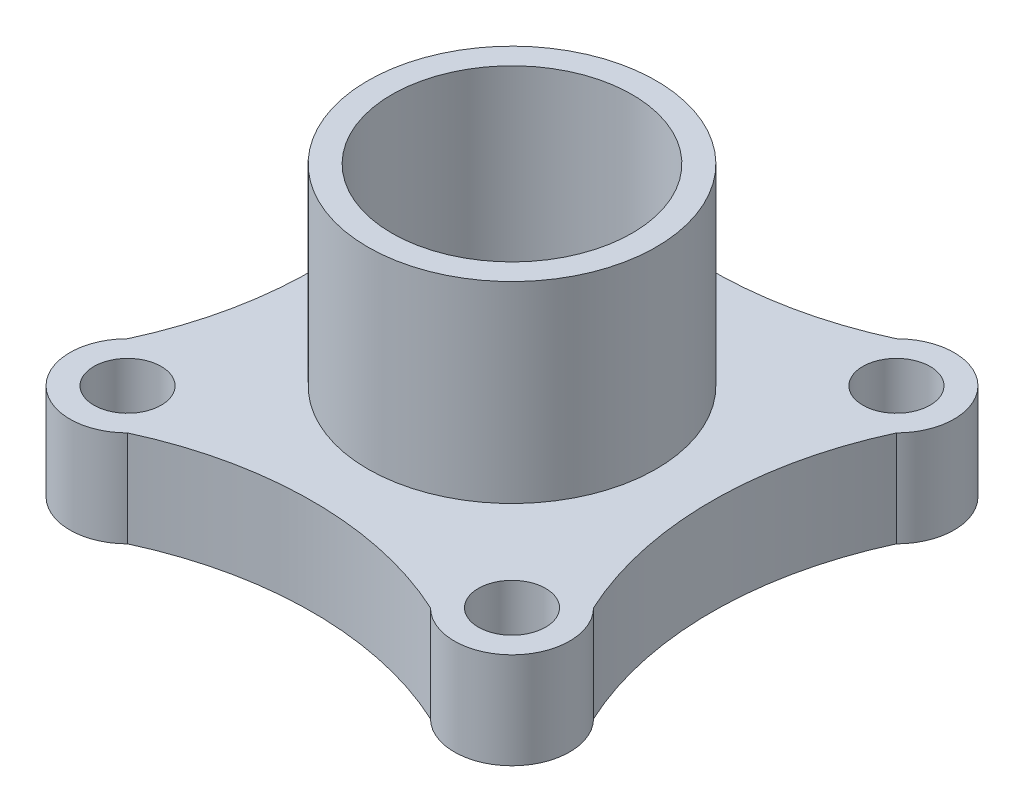
ISO-10303-21;
HEADER;
FILE_DESCRIPTION(('STEP AP214'),'2;1');
FILE_NAME('part.step','',(''),(''),'','','');
FILE_SCHEMA(('AUTOMOTIVE_DESIGN { 1 0 10303 214 1 1 1 1 }'));
ENDSEC;
DATA;
#1=APPLICATION_CONTEXT('core data for automotive mechanical design processes');
#2=APPLICATION_PROTOCOL_DEFINITION('international standard','automotive_design',2000,#1);
#3=PRODUCT_CONTEXT('',#1,'mechanical');
#4=PRODUCT('Part','Part','',(#3));
#5=PRODUCT_RELATED_PRODUCT_CATEGORY('part','',(#4));
#6=PRODUCT_DEFINITION_FORMATION('','',#4);
#7=PRODUCT_DEFINITION_CONTEXT('part definition',#1,'design');
#8=PRODUCT_DEFINITION('design','',#6,#7);
#9=PRODUCT_DEFINITION_SHAPE('','',#8);
#10=(LENGTH_UNIT() NAMED_UNIT(*) SI_UNIT(.MILLI.,.METRE.));
#11=(NAMED_UNIT(*) PLANE_ANGLE_UNIT() SI_UNIT($,.RADIAN.));
#12=(NAMED_UNIT(*) SI_UNIT($,.STERADIAN.) SOLID_ANGLE_UNIT());
#13=UNCERTAINTY_MEASURE_WITH_UNIT(LENGTH_MEASURE(1.E-05),#10,'distance_accuracy_value','');
#14=(GEOMETRIC_REPRESENTATION_CONTEXT(3) GLOBAL_UNCERTAINTY_ASSIGNED_CONTEXT((#13)) GLOBAL_UNIT_ASSIGNED_CONTEXT((#10,
#11,#12)) REPRESENTATION_CONTEXT('',''));
#15=CARTESIAN_POINT('',(0.,0.,0.));
#16=DIRECTION('',(0.,0.,1.));
#17=DIRECTION('',(1.,0.,0.));
#18=AXIS2_PLACEMENT_3D('',#15,#16,#17);
#19=CARTESIAN_POINT('',(0.,40.,0.));
#20=DIRECTION('',(0.,-1.,0.));
#21=DIRECTION('',(0.,0.,-1.));
#22=AXIS2_PLACEMENT_3D('',#19,#20,#21);
#23=CYLINDRICAL_SURFACE('',#22,30.);
#24=CARTESIAN_POINT('',(0.,40.,0.));
#25=DIRECTION('',(0.,1.,0.));
#26=DIRECTION('',(0.,0.,1.));
#27=AXIS2_PLACEMENT_3D('',#24,#25,#26);
#28=CIRCLE('',#27,30.);
#29=CARTESIAN_POINT('',(0.,40.,30.));
#30=VERTEX_POINT('',#29);
#31=EDGE_CURVE('E11',#30,#30,#28,.T.);
#32=ORIENTED_EDGE('',*,*,#31,.F.);
#33=EDGE_LOOP('',(#32));
#34=FACE_BOUND('',#33,.T.);
#35=CARTESIAN_POINT('',(0.,0.,0.));
#36=DIRECTION('',(0.,1.,0.));
#37=DIRECTION('',(0.,0.,1.));
#38=AXIS2_PLACEMENT_3D('',#35,#36,#37);
#39=CIRCLE('',#38,30.);
#40=CARTESIAN_POINT('',(0.,0.,30.));
#41=VERTEX_POINT('',#40);
#42=EDGE_CURVE('E46',#41,#41,#39,.T.);
#43=ORIENTED_EDGE('',*,*,#42,.T.);
#44=EDGE_LOOP('',(#43));
#45=FACE_BOUND('',#44,.T.);
#46=ADVANCED_FACE('F43',(#34,#45),#23,.T.);
#47=CARTESIAN_POINT('',(0.,40.,0.));
#48=DIRECTION('',(0.,1.,0.));
#49=DIRECTION('',(0.,0.,1.));
#50=AXIS2_PLACEMENT_3D('',#47,#48,#49);
#51=PLANE('',#50);
#52=CARTESIAN_POINT('',(0.,40.,0.));
#53=DIRECTION('',(0.,1.,0.));
#54=DIRECTION('',(0.,0.,1.));
#55=AXIS2_PLACEMENT_3D('',#52,#53,#54);
#56=CIRCLE('',#55,25.);
#57=CARTESIAN_POINT('',(0.,40.,25.));
#58=VERTEX_POINT('',#57);
#59=EDGE_CURVE('E401',#58,#58,#56,.T.);
#60=ORIENTED_EDGE('',*,*,#59,.F.);
#61=EDGE_LOOP('',(#60));
#62=FACE_BOUND('',#61,.T.);
#63=ORIENTED_EDGE('',*,*,#31,.T.);
#64=EDGE_LOOP('',(#63));
#65=FACE_BOUND('',#64,.T.);
#66=ADVANCED_FACE('F217',(#62,#65),#51,.T.);
#67=CARTESIAN_POINT('',(0.,-20.,116.542775523958));
#68=DIRECTION('',(0.,1.,0.));
#69=DIRECTION('',(0.,0.,1.));
#70=AXIS2_PLACEMENT_3D('',#67,#68,#69);
#71=CYLINDRICAL_SURFACE('',#70,75.);
#72=CARTESIAN_POINT('',(0.,0.,116.542775523958));
#73=DIRECTION('',(0.,1.,0.));
#74=DIRECTION('',(0.,0.,1.));
#75=AXIS2_PLACEMENT_3D('',#72,#73,#74);
#76=CIRCLE('',#75,75.);
#77=CARTESIAN_POINT('',(31.5147186257614,0.,48.4852813742385));
#78=VERTEX_POINT('',#77);
#79=CARTESIAN_POINT('',(-31.5147186257614,0.,48.4852813742386));
#80=VERTEX_POINT('',#79);
#81=EDGE_CURVE('E145',#78,#80,#76,.T.);
#82=ORIENTED_EDGE('',*,*,#81,.T.);
#83=DIRECTION('',(0.,1.,0.));
#84=VECTOR('',#83,1.);
#85=CARTESIAN_POINT('',(-31.5147186257614,-20.,48.4852813742386));
#86=LINE('',#85,#84);
#87=CARTESIAN_POINT('',(-31.5147186257614,-20.,48.4852813742386));
#88=VERTEX_POINT('',#87);
#89=EDGE_CURVE('E187',#88,#80,#86,.T.);
#90=ORIENTED_EDGE('',*,*,#89,.F.);
#91=CARTESIAN_POINT('',(0.,-20.,116.542775523958));
#92=DIRECTION('',(0.,1.,0.));
#93=DIRECTION('',(0.,0.,1.));
#94=AXIS2_PLACEMENT_3D('',#91,#92,#93);
#95=CIRCLE('',#94,75.);
#96=CARTESIAN_POINT('',(31.5147186257614,-20.,48.4852813742385));
#97=VERTEX_POINT('',#96);
#98=EDGE_CURVE('E168',#97,#88,#95,.T.);
#99=ORIENTED_EDGE('',*,*,#98,.F.);
#100=DIRECTION('',(0.,1.,0.));
#101=VECTOR('',#100,1.);
#102=CARTESIAN_POINT('',(31.5147186257614,-20.,48.4852813742385));
#103=LINE('',#102,#101);
#104=EDGE_CURVE('E141',#97,#78,#103,.T.);
#105=ORIENTED_EDGE('',*,*,#104,.T.);
#106=EDGE_LOOP('',(#82,#90,#99,#105));
#107=FACE_BOUND('',#106,.T.);
#108=ADVANCED_FACE('F204',(#107),#71,.F.);
#109=CARTESIAN_POINT('',(-40.,-20.,40.));
#110=DIRECTION('',(0.,1.,0.));
#111=DIRECTION('',(0.,0.,1.));
#112=AXIS2_PLACEMENT_3D('',#109,#110,#111);
#113=CYLINDRICAL_SURFACE('',#112,12.);
#114=CARTESIAN_POINT('',(-40.,0.,40.));
#115=DIRECTION('',(0.,-1.,0.));
#116=DIRECTION('',(0.,0.,-1.));
#117=AXIS2_PLACEMENT_3D('',#114,#115,#116);
#118=CIRCLE('',#117,12.);
#119=CARTESIAN_POINT('',(-48.4852813742386,0.,31.5147186257614));
#120=VERTEX_POINT('',#119);
#121=EDGE_CURVE('E149',#80,#120,#118,.T.);
#122=ORIENTED_EDGE('',*,*,#121,.T.);
#123=DIRECTION('',(0.,1.,0.));
#124=VECTOR('',#123,1.);
#125=CARTESIAN_POINT('',(-48.4852813742386,-20.,31.5147186257614));
#126=LINE('',#125,#124);
#127=CARTESIAN_POINT('',(-48.4852813742386,-20.,31.5147186257614));
#128=VERTEX_POINT('',#127);
#129=EDGE_CURVE('E183',#128,#120,#126,.T.);
#130=ORIENTED_EDGE('',*,*,#129,.F.);
#131=CARTESIAN_POINT('',(-40.,-20.,40.));
#132=DIRECTION('',(0.,-1.,0.));
#133=DIRECTION('',(0.,0.,-1.));
#134=AXIS2_PLACEMENT_3D('',#131,#132,#133);
#135=CIRCLE('',#134,12.);
#136=EDGE_CURVE('E104',#88,#128,#135,.T.);
#137=ORIENTED_EDGE('',*,*,#136,.F.);
#138=ORIENTED_EDGE('',*,*,#89,.T.);
#139=EDGE_LOOP('',(#122,#130,#137,#138));
#140=FACE_BOUND('',#139,.T.);
#141=ADVANCED_FACE('F228',(#140),#113,.T.);
#142=CARTESIAN_POINT('',(-116.542775523958,-20.,0.));
#143=DIRECTION('',(0.,1.,0.));
#144=DIRECTION('',(0.,0.,1.));
#145=AXIS2_PLACEMENT_3D('',#142,#143,#144);
#146=CYLINDRICAL_SURFACE('',#145,75.);
#147=CARTESIAN_POINT('',(-116.542775523958,0.,0.));
#148=DIRECTION('',(0.,1.,0.));
#149=DIRECTION('',(0.,0.,1.));
#150=AXIS2_PLACEMENT_3D('',#147,#148,#149);
#151=CIRCLE('',#150,75.);
#152=CARTESIAN_POINT('',(-48.4852813742386,0.,-31.5147186257614));
#153=VERTEX_POINT('',#152);
#154=EDGE_CURVE('E153',#120,#153,#151,.T.);
#155=ORIENTED_EDGE('',*,*,#154,.T.);
#156=DIRECTION('',(0.,1.,0.));
#157=VECTOR('',#156,1.);
#158=CARTESIAN_POINT('',(-48.4852813742386,-20.,-31.5147186257614));
#159=LINE('',#158,#157);
#160=CARTESIAN_POINT('',(-48.4852813742386,-20.,-31.5147186257614));
#161=VERTEX_POINT('',#160);
#162=EDGE_CURVE('E179',#161,#153,#159,.T.);
#163=ORIENTED_EDGE('',*,*,#162,.F.);
#164=CARTESIAN_POINT('',(-116.542775523958,-20.,0.));
#165=DIRECTION('',(0.,1.,0.));
#166=DIRECTION('',(0.,0.,1.));
#167=AXIS2_PLACEMENT_3D('',#164,#165,#166);
#168=CIRCLE('',#167,75.);
#169=EDGE_CURVE('E442',#128,#161,#168,.T.);
#170=ORIENTED_EDGE('',*,*,#169,.F.);
#171=ORIENTED_EDGE('',*,*,#129,.T.);
#172=EDGE_LOOP('',(#155,#163,#170,#171));
#173=FACE_BOUND('',#172,.T.);
#174=ADVANCED_FACE('F234',(#173),#146,.F.);
#175=CARTESIAN_POINT('',(-40.,-20.,-40.));
#176=DIRECTION('',(0.,1.,0.));
#177=DIRECTION('',(0.,0.,1.));
#178=AXIS2_PLACEMENT_3D('',#175,#176,#177);
#179=CYLINDRICAL_SURFACE('',#178,12.);
#180=CARTESIAN_POINT('',(-40.,0.,-40.));
#181=DIRECTION('',(0.,-1.,0.));
#182=DIRECTION('',(0.,0.,-1.));
#183=AXIS2_PLACEMENT_3D('',#180,#181,#182);
#184=CIRCLE('',#183,12.);
#185=CARTESIAN_POINT('',(-31.5147186257614,0.,-48.4852813742385));
#186=VERTEX_POINT('',#185);
#187=EDGE_CURVE('E156',#153,#186,#184,.T.);
#188=ORIENTED_EDGE('',*,*,#187,.T.);
#189=DIRECTION('',(0.,1.,0.));
#190=VECTOR('',#189,1.);
#191=CARTESIAN_POINT('',(-31.5147186257614,-20.,-48.4852813742385));
#192=LINE('',#191,#190);
#193=CARTESIAN_POINT('',(-31.5147186257614,-20.,-48.4852813742385));
#194=VERTEX_POINT('',#193);
#195=EDGE_CURVE('E175',#194,#186,#192,.T.);
#196=ORIENTED_EDGE('',*,*,#195,.F.);
#197=CARTESIAN_POINT('',(-40.,-20.,-40.));
#198=DIRECTION('',(0.,-1.,0.));
#199=DIRECTION('',(0.,0.,-1.));
#200=AXIS2_PLACEMENT_3D('',#197,#198,#199);
#201=CIRCLE('',#200,12.);
#202=EDGE_CURVE('E445',#161,#194,#201,.T.);
#203=ORIENTED_EDGE('',*,*,#202,.F.);
#204=ORIENTED_EDGE('',*,*,#162,.T.);
#205=EDGE_LOOP('',(#188,#196,#203,#204));
#206=FACE_BOUND('',#205,.T.);
#207=ADVANCED_FACE('F237',(#206),#179,.T.);
#208=CARTESIAN_POINT('',(0.,-20.,-116.542775523958));
#209=DIRECTION('',(0.,1.,0.));
#210=DIRECTION('',(0.,0.,1.));
#211=AXIS2_PLACEMENT_3D('',#208,#209,#210);
#212=CYLINDRICAL_SURFACE('',#211,75.);
#213=CARTESIAN_POINT('',(0.,0.,-116.542775523958));
#214=DIRECTION('',(0.,1.,0.));
#215=DIRECTION('',(0.,0.,-1.));
#216=AXIS2_PLACEMENT_3D('',#213,#214,#215);
#217=CIRCLE('',#216,75.);
#218=CARTESIAN_POINT('',(31.5147186257614,0.,-48.4852813742386));
#219=VERTEX_POINT('',#218);
#220=EDGE_CURVE('E159',#186,#219,#217,.T.);
#221=ORIENTED_EDGE('',*,*,#220,.T.);
#222=DIRECTION('',(0.,1.,0.));
#223=VECTOR('',#222,1.);
#224=CARTESIAN_POINT('',(31.5147186257614,-20.,-48.4852813742386));
#225=LINE('',#224,#223);
#226=CARTESIAN_POINT('',(31.5147186257614,-20.,-48.4852813742386));
#227=VERTEX_POINT('',#226);
#228=EDGE_CURVE('E134',#227,#219,#225,.T.);
#229=ORIENTED_EDGE('',*,*,#228,.F.);
#230=CARTESIAN_POINT('',(0.,-20.,-116.542775523958));
#231=DIRECTION('',(0.,1.,0.));
#232=DIRECTION('',(0.,0.,-1.));
#233=AXIS2_PLACEMENT_3D('',#230,#231,#232);
#234=CIRCLE('',#233,75.);
#235=EDGE_CURVE('E123',#194,#227,#234,.T.);
#236=ORIENTED_EDGE('',*,*,#235,.F.);
#237=ORIENTED_EDGE('',*,*,#195,.T.);
#238=EDGE_LOOP('',(#221,#229,#236,#237));
#239=FACE_BOUND('',#238,.T.);
#240=ADVANCED_FACE('F241',(#239),#212,.F.);
#241=CARTESIAN_POINT('',(40.,-20.,-40.));
#242=DIRECTION('',(0.,1.,0.));
#243=DIRECTION('',(0.,0.,1.));
#244=AXIS2_PLACEMENT_3D('',#241,#242,#243);
#245=CYLINDRICAL_SURFACE('',#244,12.);
#246=CARTESIAN_POINT('',(40.,0.,-40.));
#247=DIRECTION('',(0.,-1.,0.));
#248=DIRECTION('',(0.,0.,-1.));
#249=AXIS2_PLACEMENT_3D('',#246,#247,#248);
#250=CIRCLE('',#249,12.);
#251=CARTESIAN_POINT('',(48.4852813742386,0.,-31.5147186257614));
#252=VERTEX_POINT('',#251);
#253=EDGE_CURVE('E132',#219,#252,#250,.T.);
#254=ORIENTED_EDGE('',*,*,#253,.T.);
#255=DIRECTION('',(0.,1.,0.));
#256=VECTOR('',#255,1.);
#257=CARTESIAN_POINT('',(48.4852813742386,-20.,-31.5147186257614));
#258=LINE('',#257,#256);
#259=CARTESIAN_POINT('',(48.4852813742386,-20.,-31.5147186257614));
#260=VERTEX_POINT('',#259);
#261=EDGE_CURVE('E129',#260,#252,#258,.T.);
#262=ORIENTED_EDGE('',*,*,#261,.F.);
#263=CARTESIAN_POINT('',(40.,-20.,-40.));
#264=DIRECTION('',(0.,-1.,0.));
#265=DIRECTION('',(0.,0.,-1.));
#266=AXIS2_PLACEMENT_3D('',#263,#264,#265);
#267=CIRCLE('',#266,12.);
#268=EDGE_CURVE('E117',#227,#260,#267,.T.);
#269=ORIENTED_EDGE('',*,*,#268,.F.);
#270=ORIENTED_EDGE('',*,*,#228,.T.);
#271=EDGE_LOOP('',(#254,#262,#269,#270));
#272=FACE_BOUND('',#271,.T.);
#273=ADVANCED_FACE('F130',(#272),#245,.T.);
#274=CARTESIAN_POINT('',(116.542775523958,-20.,0.));
#275=DIRECTION('',(0.,1.,0.));
#276=DIRECTION('',(0.,0.,1.));
#277=AXIS2_PLACEMENT_3D('',#274,#275,#276);
#278=CYLINDRICAL_SURFACE('',#277,75.);
#279=CARTESIAN_POINT('',(116.542775523958,0.,0.));
#280=DIRECTION('',(0.,1.,0.));
#281=DIRECTION('',(0.,0.,1.));
#282=AXIS2_PLACEMENT_3D('',#279,#280,#281);
#283=CIRCLE('',#282,75.);
#284=CARTESIAN_POINT('',(48.4852813742386,0.,31.5147186257614));
#285=VERTEX_POINT('',#284);
#286=EDGE_CURVE('E89',#252,#285,#283,.T.);
#287=ORIENTED_EDGE('',*,*,#286,.T.);
#288=DIRECTION('',(0.,1.,0.));
#289=VECTOR('',#288,1.);
#290=CARTESIAN_POINT('',(48.4852813742386,-20.,31.5147186257614));
#291=LINE('',#290,#289);
#292=CARTESIAN_POINT('',(48.4852813742386,-20.,31.5147186257614));
#293=VERTEX_POINT('',#292);
#294=EDGE_CURVE('E135',#293,#285,#291,.T.);
#295=ORIENTED_EDGE('',*,*,#294,.F.);
#296=CARTESIAN_POINT('',(116.542775523958,-20.,0.));
#297=DIRECTION('',(0.,1.,0.));
#298=DIRECTION('',(0.,0.,1.));
#299=AXIS2_PLACEMENT_3D('',#296,#297,#298);
#300=CIRCLE('',#299,75.);
#301=EDGE_CURVE('E121',#260,#293,#300,.T.);
#302=ORIENTED_EDGE('',*,*,#301,.F.);
#303=ORIENTED_EDGE('',*,*,#261,.T.);
#304=EDGE_LOOP('',(#287,#295,#302,#303));
#305=FACE_BOUND('',#304,.T.);
#306=ADVANCED_FACE('F137',(#305),#278,.F.);
#307=CARTESIAN_POINT('',(40.,-20.,40.));
#308=DIRECTION('',(0.,1.,0.));
#309=DIRECTION('',(0.,0.,1.));
#310=AXIS2_PLACEMENT_3D('',#307,#308,#309);
#311=CYLINDRICAL_SURFACE('',#310,12.);
#312=CARTESIAN_POINT('',(40.,0.,40.));
#313=DIRECTION('',(0.,-1.,0.));
#314=DIRECTION('',(0.,0.,-1.));
#315=AXIS2_PLACEMENT_3D('',#312,#313,#314);
#316=CIRCLE('',#315,12.);
#317=EDGE_CURVE('E95',#285,#78,#316,.T.);
#318=ORIENTED_EDGE('',*,*,#317,.T.);
#319=ORIENTED_EDGE('',*,*,#104,.F.);
#320=CARTESIAN_POINT('',(40.,-20.,40.));
#321=DIRECTION('',(0.,-1.,0.));
#322=DIRECTION('',(0.,0.,-1.));
#323=AXIS2_PLACEMENT_3D('',#320,#321,#322);
#324=CIRCLE('',#323,12.);
#325=EDGE_CURVE('E60',#293,#97,#324,.T.);
#326=ORIENTED_EDGE('',*,*,#325,.F.);
#327=ORIENTED_EDGE('',*,*,#294,.T.);
#328=EDGE_LOOP('',(#318,#319,#326,#327));
#329=FACE_BOUND('',#328,.T.);
#330=ADVANCED_FACE('F206',(#329),#311,.T.);
#331=CARTESIAN_POINT('',(-20.,-20.,78.271387761979));
#332=DIRECTION('',(0.,1.,0.));
#333=DIRECTION('',(0.,0.,1.));
#334=AXIS2_PLACEMENT_3D('',#331,#332,#333);
#335=PLANE('',#334);
#336=CARTESIAN_POINT('',(0.,-20.,0.));
#337=DIRECTION('',(0.,1.,0.));
#338=DIRECTION('',(0.,0.,1.));
#339=AXIS2_PLACEMENT_3D('',#336,#337,#338);
#340=CIRCLE('',#339,25.);
#341=CARTESIAN_POINT('',(0.,-20.,25.));
#342=VERTEX_POINT('',#341);
#343=EDGE_CURVE('E399',#342,#342,#340,.T.);
#344=ORIENTED_EDGE('',*,*,#343,.T.);
#345=EDGE_LOOP('',(#344));
#346=FACE_BOUND('',#345,.T.);
#347=CARTESIAN_POINT('',(-40.,-20.,40.));
#348=DIRECTION('',(0.,1.,0.));
#349=DIRECTION('',(0.,0.,1.));
#350=AXIS2_PLACEMENT_3D('',#347,#348,#349);
#351=CIRCLE('',#350,7.);
#352=CARTESIAN_POINT('',(-40.,-20.,47.));
#353=VERTEX_POINT('',#352);
#354=EDGE_CURVE('E405',#353,#353,#351,.T.);
#355=ORIENTED_EDGE('',*,*,#354,.T.);
#356=EDGE_LOOP('',(#355));
#357=FACE_BOUND('',#356,.T.);
#358=CARTESIAN_POINT('',(40.,-20.,-40.));
#359=DIRECTION('',(0.,1.,0.));
#360=DIRECTION('',(0.,0.,1.));
#361=AXIS2_PLACEMENT_3D('',#358,#359,#360);
#362=CIRCLE('',#361,7.);
#363=CARTESIAN_POINT('',(40.,-20.,-33.));
#364=VERTEX_POINT('',#363);
#365=EDGE_CURVE('E421',#364,#364,#362,.T.);
#366=ORIENTED_EDGE('',*,*,#365,.T.);
#367=EDGE_LOOP('',(#366));
#368=FACE_BOUND('',#367,.T.);
#369=CARTESIAN_POINT('',(40.,-20.,40.));
#370=DIRECTION('',(0.,1.,0.));
#371=DIRECTION('',(0.,0.,1.));
#372=AXIS2_PLACEMENT_3D('',#369,#370,#371);
#373=CIRCLE('',#372,7.);
#374=CARTESIAN_POINT('',(40.,-20.,47.));
#375=VERTEX_POINT('',#374);
#376=EDGE_CURVE('E413',#375,#375,#373,.T.);
#377=ORIENTED_EDGE('',*,*,#376,.T.);
#378=EDGE_LOOP('',(#377));
#379=FACE_BOUND('',#378,.T.);
#380=CARTESIAN_POINT('',(-40.,-20.,-40.));
#381=DIRECTION('',(0.,1.,0.));
#382=DIRECTION('',(0.,0.,1.));
#383=AXIS2_PLACEMENT_3D('',#380,#381,#382);
#384=CIRCLE('',#383,7.);
#385=CARTESIAN_POINT('',(-40.,-20.,-33.));
#386=VERTEX_POINT('',#385);
#387=EDGE_CURVE('E150',#386,#386,#384,.T.);
#388=ORIENTED_EDGE('',*,*,#387,.T.);
#389=EDGE_LOOP('',(#388));
#390=FACE_BOUND('',#389,.T.);
#391=ORIENTED_EDGE('',*,*,#98,.T.);
#392=ORIENTED_EDGE('',*,*,#136,.T.);
#393=ORIENTED_EDGE('',*,*,#169,.T.);
#394=ORIENTED_EDGE('',*,*,#202,.T.);
#395=ORIENTED_EDGE('',*,*,#235,.T.);
#396=ORIENTED_EDGE('',*,*,#268,.T.);
#397=ORIENTED_EDGE('',*,*,#301,.T.);
#398=ORIENTED_EDGE('',*,*,#325,.T.);
#399=EDGE_LOOP('',(#391,#392,#393,#394,#395,#396,#397,#398));
#400=FACE_BOUND('',#399,.T.);
#401=ADVANCED_FACE('F119',(#346,#357,#368,#379,#390,#400),#335,.F.);
#402=CARTESIAN_POINT('',(-20.,0.,78.271387761979));
#403=DIRECTION('',(0.,1.,0.));
#404=DIRECTION('',(0.,0.,1.));
#405=AXIS2_PLACEMENT_3D('',#402,#403,#404);
#406=PLANE('',#405);
#407=CARTESIAN_POINT('',(-40.,0.,40.));
#408=DIRECTION('',(0.,1.,0.));
#409=DIRECTION('',(0.,0.,1.));
#410=AXIS2_PLACEMENT_3D('',#407,#408,#409);
#411=CIRCLE('',#410,7.);
#412=CARTESIAN_POINT('',(-40.,0.,47.));
#413=VERTEX_POINT('',#412);
#414=EDGE_CURVE('E425',#413,#413,#411,.T.);
#415=ORIENTED_EDGE('',*,*,#414,.F.);
#416=EDGE_LOOP('',(#415));
#417=FACE_BOUND('',#416,.T.);
#418=CARTESIAN_POINT('',(40.,0.,-40.));
#419=DIRECTION('',(0.,1.,0.));
#420=DIRECTION('',(0.,0.,1.));
#421=AXIS2_PLACEMENT_3D('',#418,#419,#420);
#422=CIRCLE('',#421,7.);
#423=CARTESIAN_POINT('',(40.,0.,-33.));
#424=VERTEX_POINT('',#423);
#425=EDGE_CURVE('E417',#424,#424,#422,.T.);
#426=ORIENTED_EDGE('',*,*,#425,.F.);
#427=EDGE_LOOP('',(#426));
#428=FACE_BOUND('',#427,.T.);
#429=CARTESIAN_POINT('',(40.,0.,40.));
#430=DIRECTION('',(0.,1.,0.));
#431=DIRECTION('',(0.,0.,1.));
#432=AXIS2_PLACEMENT_3D('',#429,#430,#431);
#433=CIRCLE('',#432,7.);
#434=CARTESIAN_POINT('',(40.,0.,47.));
#435=VERTEX_POINT('',#434);
#436=EDGE_CURVE('E408',#435,#435,#433,.T.);
#437=ORIENTED_EDGE('',*,*,#436,.F.);
#438=EDGE_LOOP('',(#437));
#439=FACE_BOUND('',#438,.T.);
#440=CARTESIAN_POINT('',(-40.,0.,-40.));
#441=DIRECTION('',(0.,1.,0.));
#442=DIRECTION('',(0.,0.,1.));
#443=AXIS2_PLACEMENT_3D('',#440,#441,#442);
#444=CIRCLE('',#443,7.);
#445=CARTESIAN_POINT('',(-40.,0.,-33.));
#446=VERTEX_POINT('',#445);
#447=EDGE_CURVE('E412',#446,#446,#444,.T.);
#448=ORIENTED_EDGE('',*,*,#447,.F.);
#449=EDGE_LOOP('',(#448));
#450=FACE_BOUND('',#449,.T.);
#451=ORIENTED_EDGE('',*,*,#42,.F.);
#452=EDGE_LOOP('',(#451));
#453=FACE_BOUND('',#452,.T.);
#454=ORIENTED_EDGE('',*,*,#81,.F.);
#455=ORIENTED_EDGE('',*,*,#317,.F.);
#456=ORIENTED_EDGE('',*,*,#286,.F.);
#457=ORIENTED_EDGE('',*,*,#253,.F.);
#458=ORIENTED_EDGE('',*,*,#220,.F.);
#459=ORIENTED_EDGE('',*,*,#187,.F.);
#460=ORIENTED_EDGE('',*,*,#154,.F.);
#461=ORIENTED_EDGE('',*,*,#121,.F.);
#462=EDGE_LOOP('',(#454,#455,#456,#457,#458,#459,#460,#461));
#463=FACE_BOUND('',#462,.T.);
#464=ADVANCED_FACE('F195',(#417,#428,#439,#450,#453,#463),#406,.T.);
#465=CARTESIAN_POINT('',(-40.,-20.,-40.));
#466=DIRECTION('',(0.,1.,0.));
#467=DIRECTION('',(0.,0.,1.));
#468=AXIS2_PLACEMENT_3D('',#465,#466,#467);
#469=CYLINDRICAL_SURFACE('',#468,7.);
#470=ORIENTED_EDGE('',*,*,#387,.F.);
#471=EDGE_LOOP('',(#470));
#472=FACE_BOUND('',#471,.T.);
#473=ORIENTED_EDGE('',*,*,#447,.T.);
#474=EDGE_LOOP('',(#473));
#475=FACE_BOUND('',#474,.T.);
#476=ADVANCED_FACE('F198',(#472,#475),#469,.F.);
#477=CARTESIAN_POINT('',(40.,-20.,40.));
#478=DIRECTION('',(0.,1.,0.));
#479=DIRECTION('',(0.,0.,1.));
#480=AXIS2_PLACEMENT_3D('',#477,#478,#479);
#481=CYLINDRICAL_SURFACE('',#480,7.);
#482=ORIENTED_EDGE('',*,*,#376,.F.);
#483=EDGE_LOOP('',(#482));
#484=FACE_BOUND('',#483,.T.);
#485=ORIENTED_EDGE('',*,*,#436,.T.);
#486=EDGE_LOOP('',(#485));
#487=FACE_BOUND('',#486,.T.);
#488=ADVANCED_FACE('F278',(#484,#487),#481,.F.);
#489=CARTESIAN_POINT('',(40.,-20.,-40.));
#490=DIRECTION('',(0.,1.,0.));
#491=DIRECTION('',(0.,0.,1.));
#492=AXIS2_PLACEMENT_3D('',#489,#490,#491);
#493=CYLINDRICAL_SURFACE('',#492,7.);
#494=ORIENTED_EDGE('',*,*,#365,.F.);
#495=EDGE_LOOP('',(#494));
#496=FACE_BOUND('',#495,.T.);
#497=ORIENTED_EDGE('',*,*,#425,.T.);
#498=EDGE_LOOP('',(#497));
#499=FACE_BOUND('',#498,.T.);
#500=ADVANCED_FACE('F289',(#496,#499),#493,.F.);
#501=CARTESIAN_POINT('',(-40.,-20.,40.));
#502=DIRECTION('',(0.,1.,0.));
#503=DIRECTION('',(0.,0.,1.));
#504=AXIS2_PLACEMENT_3D('',#501,#502,#503);
#505=CYLINDRICAL_SURFACE('',#504,7.);
#506=ORIENTED_EDGE('',*,*,#354,.F.);
#507=EDGE_LOOP('',(#506));
#508=FACE_BOUND('',#507,.T.);
#509=ORIENTED_EDGE('',*,*,#414,.T.);
#510=EDGE_LOOP('',(#509));
#511=FACE_BOUND('',#510,.T.);
#512=ADVANCED_FACE('F300',(#508,#511),#505,.F.);
#513=CARTESIAN_POINT('',(0.,-20.,0.));
#514=DIRECTION('',(0.,1.,0.));
#515=DIRECTION('',(0.,0.,1.));
#516=AXIS2_PLACEMENT_3D('',#513,#514,#515);
#517=CYLINDRICAL_SURFACE('',#516,25.);
#518=ORIENTED_EDGE('',*,*,#343,.F.);
#519=EDGE_LOOP('',(#518));
#520=FACE_BOUND('',#519,.T.);
#521=ORIENTED_EDGE('',*,*,#59,.T.);
#522=EDGE_LOOP('',(#521));
#523=FACE_BOUND('',#522,.T.);
#524=ADVANCED_FACE('F310',(#520,#523),#517,.F.);
#525=CLOSED_SHELL('',(#46,#66,#108,#141,#174,#207,#240,#273,#306,#330,#401,#464,#476,#488,#500,
#512,#524));
#526=MANIFOLD_SOLID_BREP('B2',#525);
#527=ADVANCED_BREP_SHAPE_REPRESENTATION('',(#18,#526),#14);
#528=SHAPE_DEFINITION_REPRESENTATION(#9,#527);
ENDSEC;
END-ISO-10303-21;
